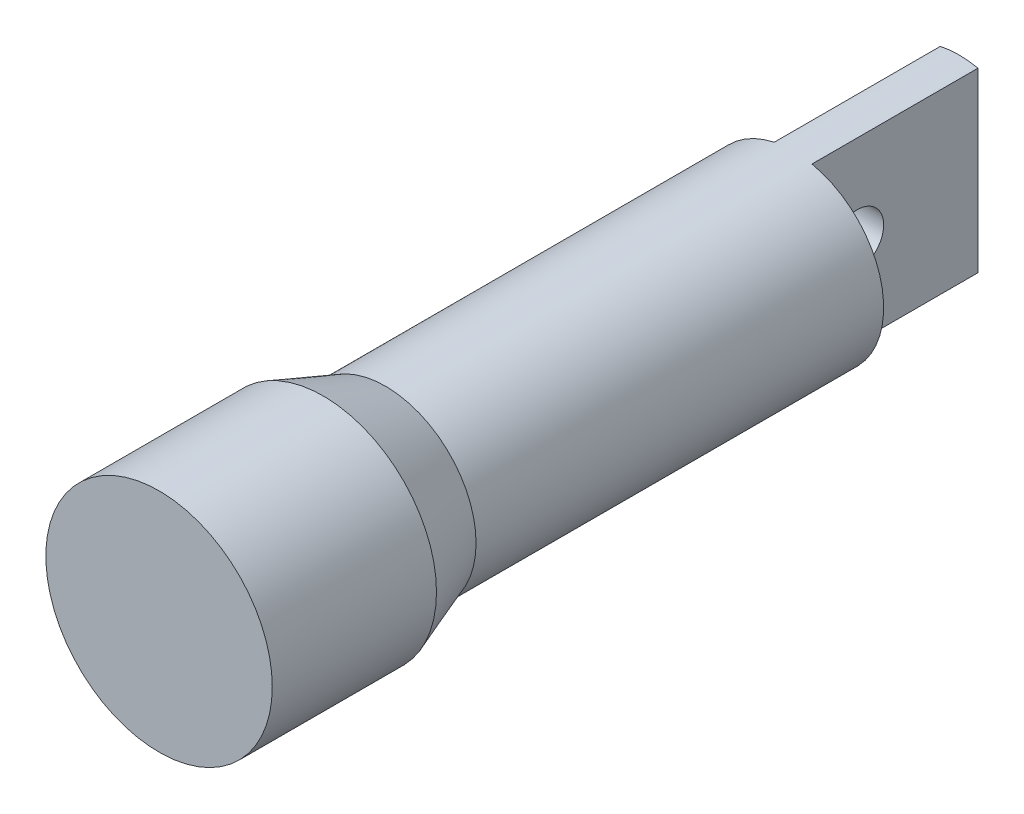
ISO-10303-21;
HEADER;
FILE_DESCRIPTION(('STEP AP214'),'2;1');
FILE_NAME('part.step','',(''),(''),'','','');
FILE_SCHEMA(('AUTOMOTIVE_DESIGN { 1 0 10303 214 1 1 1 1 }'));
ENDSEC;
DATA;
#1=APPLICATION_CONTEXT('core data for automotive mechanical design processes');
#2=APPLICATION_PROTOCOL_DEFINITION('international standard','automotive_design',2000,#1);
#3=PRODUCT_CONTEXT('',#1,'mechanical');
#4=PRODUCT('Part','Part','',(#3));
#5=PRODUCT_RELATED_PRODUCT_CATEGORY('part','',(#4));
#6=PRODUCT_DEFINITION_FORMATION('','',#4);
#7=PRODUCT_DEFINITION_CONTEXT('part definition',#1,'design');
#8=PRODUCT_DEFINITION('design','',#6,#7);
#9=PRODUCT_DEFINITION_SHAPE('','',#8);
#10=(LENGTH_UNIT() NAMED_UNIT(*) SI_UNIT(.MILLI.,.METRE.));
#11=(NAMED_UNIT(*) PLANE_ANGLE_UNIT() SI_UNIT($,.RADIAN.));
#12=(NAMED_UNIT(*) SI_UNIT($,.STERADIAN.) SOLID_ANGLE_UNIT());
#13=UNCERTAINTY_MEASURE_WITH_UNIT(LENGTH_MEASURE(1.E-05),#10,'distance_accuracy_value','');
#14=(GEOMETRIC_REPRESENTATION_CONTEXT(3) GLOBAL_UNCERTAINTY_ASSIGNED_CONTEXT((#13)) GLOBAL_UNIT_ASSIGNED_CONTEXT((#10,
#11,#12)) REPRESENTATION_CONTEXT('',''));
#15=CARTESIAN_POINT('',(0.,0.,0.));
#16=DIRECTION('',(0.,0.,1.));
#17=DIRECTION('',(1.,0.,0.));
#18=AXIS2_PLACEMENT_3D('',#15,#16,#17);
#19=CARTESIAN_POINT('',(0.,0.,0.));
#20=DIRECTION('',(0.,0.,1.));
#21=DIRECTION('',(1.,0.,0.));
#22=AXIS2_PLACEMENT_3D('',#19,#20,#21);
#23=PLANE('',#22);
#24=DIRECTION('',(0.,1.,0.));
#25=VECTOR('',#24,1.);
#26=CARTESIAN_POINT('',(-1.25,-5.86834729715275,0.));
#27=LINE('',#26,#25);
#28=CARTESIAN_POINT('',(-1.25,-5.86834729715275,0.));
#29=VERTEX_POINT('',#28);
#30=CARTESIAN_POINT('',(-1.25,5.86834729715275,0.));
#31=VERTEX_POINT('',#30);
#32=EDGE_CURVE('E54',#29,#31,#27,.T.);
#33=ORIENTED_EDGE('',*,*,#32,.F.);
#34=CARTESIAN_POINT('',(0.,0.,0.));
#35=DIRECTION('',(0.,0.,1.));
#36=DIRECTION('',(1.,0.,0.));
#37=AXIS2_PLACEMENT_3D('',#34,#35,#36);
#38=CIRCLE('',#37,6.);
#39=EDGE_CURVE('E57',#31,#29,#38,.T.);
#40=ORIENTED_EDGE('',*,*,#39,.F.);
#41=EDGE_LOOP('',(#33,#40));
#42=FACE_BOUND('',#41,.T.);
#43=ADVANCED_FACE('F39',(#42),#23,.F.);
#44=DIRECTION('',(0.,-1.,0.));
#45=VECTOR('',#44,1.);
#46=CARTESIAN_POINT('',(1.25,-5.86834729715275,0.));
#47=LINE('',#46,#45);
#48=CARTESIAN_POINT('',(1.25,5.86834729715275,0.));
#49=VERTEX_POINT('',#48);
#50=CARTESIAN_POINT('',(1.25,-5.86834729715275,0.));
#51=VERTEX_POINT('',#50);
#52=EDGE_CURVE('E111',#49,#51,#47,.T.);
#53=ORIENTED_EDGE('',*,*,#52,.F.);
#54=EDGE_CURVE('E101',#51,#49,#38,.T.);
#55=ORIENTED_EDGE('',*,*,#54,.F.);
#56=EDGE_LOOP('',(#53,#55));
#57=FACE_BOUND('',#56,.T.);
#58=ADVANCED_FACE('F143',(#57),#23,.F.);
#59=CARTESIAN_POINT('',(0.,0.,27.));
#60=DIRECTION('',(0.,0.,-1.));
#61=DIRECTION('',(-1.,0.,0.));
#62=AXIS2_PLACEMENT_3D('',#59,#60,#61);
#63=CYLINDRICAL_SURFACE('',#62,6.);
#64=CARTESIAN_POINT('',(0.,0.,27.));
#65=DIRECTION('',(0.,0.,1.));
#66=DIRECTION('',(1.,0.,0.));
#67=AXIS2_PLACEMENT_3D('',#64,#65,#66);
#68=CIRCLE('',#67,6.);
#69=CARTESIAN_POINT('',(6.,0.,27.));
#70=VERTEX_POINT('',#69);
#71=EDGE_CURVE('E48',#70,#70,#68,.T.);
#72=ORIENTED_EDGE('',*,*,#71,.F.);
#73=EDGE_LOOP('',(#72));
#74=FACE_BOUND('',#73,.T.);
#75=ORIENTED_EDGE('',*,*,#54,.T.);
#76=DIRECTION('',(0.,0.,1.));
#77=VECTOR('',#76,1.);
#78=CARTESIAN_POINT('',(1.25,5.86834729715275,-11.));
#79=LINE('',#78,#77);
#80=CARTESIAN_POINT('',(1.25,5.86834729715275,-11.));
#81=VERTEX_POINT('',#80);
#82=EDGE_CURVE('E83',#81,#49,#79,.T.);
#83=ORIENTED_EDGE('',*,*,#82,.F.);
#84=CARTESIAN_POINT('',(0.,0.,-11.));
#85=DIRECTION('',(0.,0.,-1.));
#86=DIRECTION('',(-1.,0.,0.));
#87=AXIS2_PLACEMENT_3D('',#84,#85,#86);
#88=CIRCLE('',#87,6.);
#89=CARTESIAN_POINT('',(-1.25,5.86834729715275,-11.));
#90=VERTEX_POINT('',#89);
#91=EDGE_CURVE('E89',#90,#81,#88,.T.);
#92=ORIENTED_EDGE('',*,*,#91,.F.);
#93=DIRECTION('',(0.,0.,1.));
#94=VECTOR('',#93,1.);
#95=CARTESIAN_POINT('',(-1.25,5.86834729715275,-11.));
#96=LINE('',#95,#94);
#97=EDGE_CURVE('E125',#90,#31,#96,.T.);
#98=ORIENTED_EDGE('',*,*,#97,.T.);
#99=ORIENTED_EDGE('',*,*,#39,.T.);
#100=DIRECTION('',(0.,0.,1.));
#101=VECTOR('',#100,1.);
#102=CARTESIAN_POINT('',(-1.25,-5.86834729715275,-11.));
#103=LINE('',#102,#101);
#104=CARTESIAN_POINT('',(-1.25,-5.86834729715275,-11.));
#105=VERTEX_POINT('',#104);
#106=EDGE_CURVE('E104',#105,#29,#103,.T.);
#107=ORIENTED_EDGE('',*,*,#106,.F.);
#108=CARTESIAN_POINT('',(0.,0.,-11.));
#109=DIRECTION('',(0.,0.,-1.));
#110=DIRECTION('',(-1.,0.,0.));
#111=AXIS2_PLACEMENT_3D('',#108,#109,#110);
#112=CIRCLE('',#111,6.);
#113=CARTESIAN_POINT('',(1.25,-5.86834729715275,-11.));
#114=VERTEX_POINT('',#113);
#115=EDGE_CURVE('E88',#114,#105,#112,.T.);
#116=ORIENTED_EDGE('',*,*,#115,.F.);
#117=DIRECTION('',(0.,0.,1.));
#118=VECTOR('',#117,1.);
#119=CARTESIAN_POINT('',(1.25,-5.86834729715275,-11.));
#120=LINE('',#119,#118);
#121=EDGE_CURVE('E85',#114,#51,#120,.T.);
#122=ORIENTED_EDGE('',*,*,#121,.T.);
#123=EDGE_LOOP('',(#75,#83,#92,#98,#99,#107,#116,#122));
#124=FACE_BOUND('',#123,.T.);
#125=ADVANCED_FACE('F100',(#74,#124),#63,.T.);
#126=CARTESIAN_POINT('',(1.25,-5.86834729715275,-11.));
#127=DIRECTION('',(-1.,0.,0.));
#128=DIRECTION('',(0.,0.,1.));
#129=AXIS2_PLACEMENT_3D('',#126,#127,#128);
#130=PLANE('',#129);
#131=CARTESIAN_POINT('',(1.25,0.,-3.));
#132=DIRECTION('',(1.,0.,0.));
#133=DIRECTION('',(0.,0.,-1.));
#134=AXIS2_PLACEMENT_3D('',#131,#132,#133);
#135=CIRCLE('',#134,1.75);
#136=CARTESIAN_POINT('',(1.25,0.,-4.75));
#137=VERTEX_POINT('',#136);
#138=EDGE_CURVE('E112',#137,#137,#135,.T.);
#139=ORIENTED_EDGE('',*,*,#138,.F.);
#140=EDGE_LOOP('',(#139));
#141=FACE_BOUND('',#140,.T.);
#142=ORIENTED_EDGE('',*,*,#52,.T.);
#143=ORIENTED_EDGE('',*,*,#121,.F.);
#144=DIRECTION('',(0.,-1.,0.));
#145=VECTOR('',#144,1.);
#146=CARTESIAN_POINT('',(1.25,-5.86834729715275,-11.));
#147=LINE('',#146,#145);
#148=EDGE_CURVE('E78',#81,#114,#147,.T.);
#149=ORIENTED_EDGE('',*,*,#148,.F.);
#150=ORIENTED_EDGE('',*,*,#82,.T.);
#151=EDGE_LOOP('',(#142,#143,#149,#150));
#152=FACE_BOUND('',#151,.T.);
#153=ADVANCED_FACE('F81',(#141,#152),#130,.F.);
#154=CARTESIAN_POINT('',(-1.25,-5.86834729715275,-11.));
#155=DIRECTION('',(1.,0.,0.));
#156=DIRECTION('',(0.,0.,-1.));
#157=AXIS2_PLACEMENT_3D('',#154,#155,#156);
#158=PLANE('',#157);
#159=CARTESIAN_POINT('',(-1.25,0.,-3.));
#160=DIRECTION('',(1.,0.,0.));
#161=DIRECTION('',(0.,0.,-1.));
#162=AXIS2_PLACEMENT_3D('',#159,#160,#161);
#163=CIRCLE('',#162,1.75);
#164=CARTESIAN_POINT('',(-1.25,0.,-4.75));
#165=VERTEX_POINT('',#164);
#166=EDGE_CURVE('E109',#165,#165,#163,.T.);
#167=ORIENTED_EDGE('',*,*,#166,.T.);
#168=EDGE_LOOP('',(#167));
#169=FACE_BOUND('',#168,.T.);
#170=ORIENTED_EDGE('',*,*,#32,.T.);
#171=ORIENTED_EDGE('',*,*,#97,.F.);
#172=DIRECTION('',(0.,1.,0.));
#173=VECTOR('',#172,1.);
#174=CARTESIAN_POINT('',(-1.25,-5.86834729715275,-11.));
#175=LINE('',#174,#173);
#176=EDGE_CURVE('E94',#105,#90,#175,.T.);
#177=ORIENTED_EDGE('',*,*,#176,.F.);
#178=ORIENTED_EDGE('',*,*,#106,.T.);
#179=EDGE_LOOP('',(#170,#171,#177,#178));
#180=FACE_BOUND('',#179,.T.);
#181=ADVANCED_FACE('F131',(#169,#180),#158,.F.);
#182=CARTESIAN_POINT('',(0.,0.,-11.));
#183=DIRECTION('',(0.,0.,-1.));
#184=DIRECTION('',(-1.,0.,0.));
#185=AXIS2_PLACEMENT_3D('',#182,#183,#184);
#186=PLANE('',#185);
#187=ORIENTED_EDGE('',*,*,#91,.T.);
#188=ORIENTED_EDGE('',*,*,#148,.T.);
#189=ORIENTED_EDGE('',*,*,#115,.T.);
#190=ORIENTED_EDGE('',*,*,#176,.T.);
#191=EDGE_LOOP('',(#187,#188,#189,#190));
#192=FACE_BOUND('',#191,.T.);
#193=ADVANCED_FACE('F92',(#192),#186,.T.);
#194=CARTESIAN_POINT('',(-4.75,0.,-3.));
#195=DIRECTION('',(1.,0.,0.));
#196=DIRECTION('',(0.,0.,-1.));
#197=AXIS2_PLACEMENT_3D('',#194,#195,#196);
#198=CYLINDRICAL_SURFACE('',#197,1.75);
#199=ORIENTED_EDGE('',*,*,#138,.T.);
#200=EDGE_LOOP('',(#199));
#201=FACE_BOUND('',#200,.T.);
#202=ORIENTED_EDGE('',*,*,#166,.F.);
#203=EDGE_LOOP('',(#202));
#204=FACE_BOUND('',#203,.T.);
#205=ADVANCED_FACE('F138',(#201,#204),#198,.F.);
#206=CARTESIAN_POINT('',(0.,0.,42.));
#207=DIRECTION('',(0.,0.,-1.));
#208=DIRECTION('',(-1.,0.,0.));
#209=AXIS2_PLACEMENT_3D('',#206,#207,#208);
#210=CYLINDRICAL_SURFACE('',#209,7.5);
#211=CARTESIAN_POINT('',(0.,0.,31.1212161291819));
#212=DIRECTION('',(0.,0.,1.));
#213=DIRECTION('',(1.,0.,0.));
#214=AXIS2_PLACEMENT_3D('',#211,#212,#213);
#215=CIRCLE('',#214,7.5);
#216=CARTESIAN_POINT('',(7.5,0.,31.1212161291819));
#217=VERTEX_POINT('',#216);
#218=EDGE_CURVE('E11',#217,#217,#215,.T.);
#219=ORIENTED_EDGE('',*,*,#218,.T.);
#220=EDGE_LOOP('',(#219));
#221=FACE_BOUND('',#220,.T.);
#222=CARTESIAN_POINT('',(0.,0.,42.));
#223=DIRECTION('',(0.,0.,1.));
#224=DIRECTION('',(1.,0.,0.));
#225=AXIS2_PLACEMENT_3D('',#222,#223,#224);
#226=CIRCLE('',#225,7.5);
#227=CARTESIAN_POINT('',(7.5,0.,42.));
#228=VERTEX_POINT('',#227);
#229=EDGE_CURVE('E117',#228,#228,#226,.T.);
#230=ORIENTED_EDGE('',*,*,#229,.F.);
#231=EDGE_LOOP('',(#230));
#232=FACE_BOUND('',#231,.T.);
#233=ADVANCED_FACE('F160',(#221,#232),#210,.T.);
#234=CARTESIAN_POINT('',(0.,0.,42.));
#235=DIRECTION('',(0.,0.,1.));
#236=DIRECTION('',(1.,0.,0.));
#237=AXIS2_PLACEMENT_3D('',#234,#235,#236);
#238=PLANE('',#237);
#239=ORIENTED_EDGE('',*,*,#229,.T.);
#240=EDGE_LOOP('',(#239));
#241=FACE_BOUND('',#240,.T.);
#242=ADVANCED_FACE('F157',(#241),#238,.T.);
#243=CARTESIAN_POINT('',(0.,0.,31.1212161291819));
#244=DIRECTION('',(0.,0.,1.));
#245=DIRECTION('',(1.,0.,0.));
#246=AXIS2_PLACEMENT_3D('',#243,#244,#245);
#247=CONICAL_SURFACE('',#246,7.5,0.349065850398868);
#248=ORIENTED_EDGE('',*,*,#71,.T.);
#249=EDGE_LOOP('',(#248));
#250=FACE_BOUND('',#249,.T.);
#251=ORIENTED_EDGE('',*,*,#218,.F.);
#252=EDGE_LOOP('',(#251));
#253=FACE_BOUND('',#252,.T.);
#254=ADVANCED_FACE('F42',(#250,#253),#247,.T.);
#255=CLOSED_SHELL('',(#43,#58,#125,#153,#181,#193,#205,#233,#242,#254));
#256=MANIFOLD_SOLID_BREP('B2',#255);
#257=ADVANCED_BREP_SHAPE_REPRESENTATION('',(#18,#256),#14);
#258=SHAPE_DEFINITION_REPRESENTATION(#9,#257);
ENDSEC;
END-ISO-10303-21;
